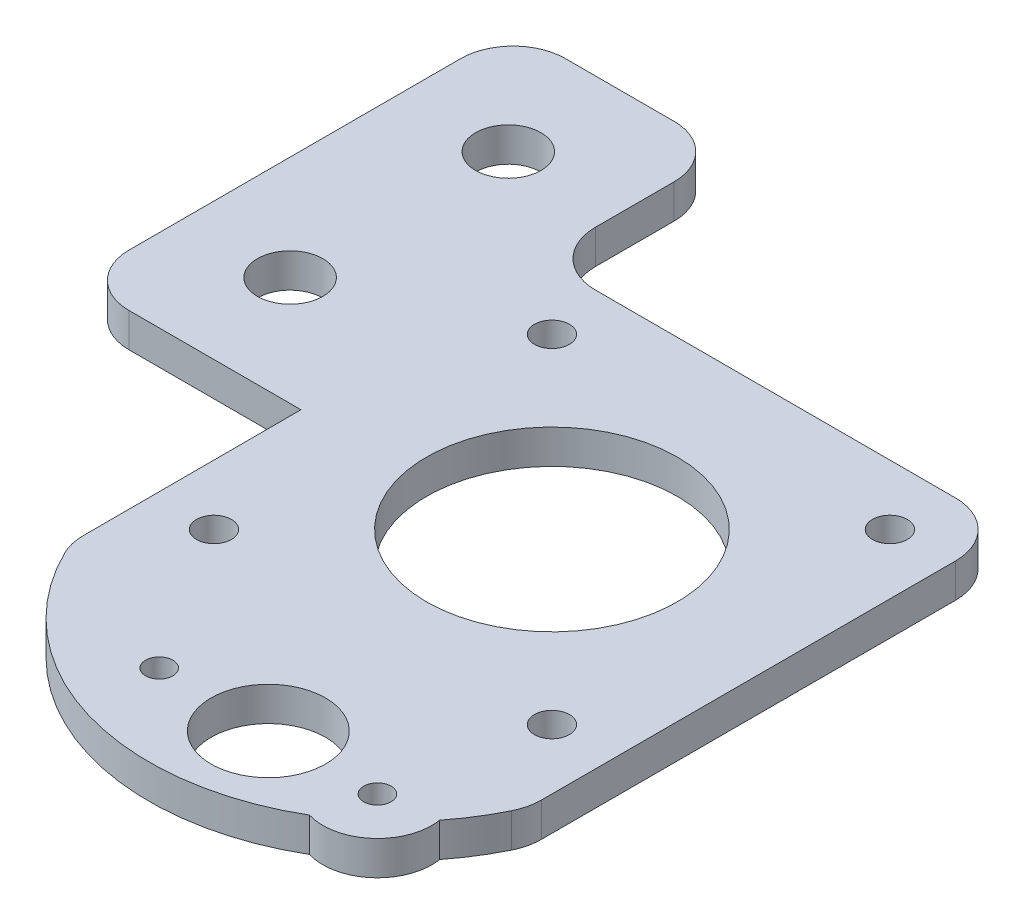
ISO-10303-21;
HEADER;
FILE_DESCRIPTION(('STEP AP214'),'2;1');
FILE_NAME('part.step','',(''),(''),'','','');
FILE_SCHEMA(('AUTOMOTIVE_DESIGN { 1 0 10303 214 1 1 1 1 }'));
ENDSEC;
DATA;
#1=APPLICATION_CONTEXT('core data for automotive mechanical design processes');
#2=APPLICATION_PROTOCOL_DEFINITION('international standard','automotive_design',2000,#1);
#3=PRODUCT_CONTEXT('',#1,'mechanical');
#4=PRODUCT('Part','Part','',(#3));
#5=PRODUCT_RELATED_PRODUCT_CATEGORY('part','',(#4));
#6=PRODUCT_DEFINITION_FORMATION('','',#4);
#7=PRODUCT_DEFINITION_CONTEXT('part definition',#1,'design');
#8=PRODUCT_DEFINITION('design','',#6,#7);
#9=PRODUCT_DEFINITION_SHAPE('','',#8);
#10=(LENGTH_UNIT() NAMED_UNIT(*) SI_UNIT(.MILLI.,.METRE.));
#11=(NAMED_UNIT(*) PLANE_ANGLE_UNIT() SI_UNIT($,.RADIAN.));
#12=(NAMED_UNIT(*) SI_UNIT($,.STERADIAN.) SOLID_ANGLE_UNIT());
#13=UNCERTAINTY_MEASURE_WITH_UNIT(LENGTH_MEASURE(1.E-05),#10,'distance_accuracy_value','');
#14=(GEOMETRIC_REPRESENTATION_CONTEXT(3) GLOBAL_UNCERTAINTY_ASSIGNED_CONTEXT((#13)) GLOBAL_UNIT_ASSIGNED_CONTEXT((#10,
#11,#12)) REPRESENTATION_CONTEXT('',''));
#15=CARTESIAN_POINT('',(0.,0.,0.));
#16=DIRECTION('',(0.,0.,1.));
#17=DIRECTION('',(1.,0.,0.));
#18=AXIS2_PLACEMENT_3D('',#15,#16,#17);
#19=CARTESIAN_POINT('',(22.4102545462496,550.,-34.706758362055));
#20=DIRECTION('',(0.,-1.,0.));
#21=DIRECTION('',(0.,0.,-1.));
#22=AXIS2_PLACEMENT_3D('',#19,#20,#21);
#23=CYLINDRICAL_SURFACE('',#22,4.8);
#24=CARTESIAN_POINT('',(22.4102545462496,546.875,-34.706758362055));
#25=DIRECTION('',(0.,-1.,0.));
#26=DIRECTION('',(0.,0.,-1.));
#27=AXIS2_PLACEMENT_3D('',#24,#25,#26);
#28=CIRCLE('',#27,4.8);
#29=CARTESIAN_POINT('',(17.6102545462496,546.875,-34.706758362055));
#30=VERTEX_POINT('',#29);
#31=CARTESIAN_POINT('',(22.4102545462496,546.875,-39.506758362055));
#32=VERTEX_POINT('',#31);
#33=EDGE_CURVE('E187',#30,#32,#28,.T.);
#34=ORIENTED_EDGE('',*,*,#33,.F.);
#35=DIRECTION('',(0.,-1.,0.));
#36=VECTOR('',#35,1.);
#37=CARTESIAN_POINT('',(17.6102545462496,550.,-34.706758362055));
#38=LINE('',#37,#36);
#39=CARTESIAN_POINT('',(17.6102545462496,550.,-34.706758362055));
#40=VERTEX_POINT('',#39);
#41=EDGE_CURVE('E11',#40,#30,#38,.T.);
#42=ORIENTED_EDGE('',*,*,#41,.F.);
#43=CARTESIAN_POINT('',(22.4102545462496,550.,-34.706758362055));
#44=DIRECTION('',(0.,-1.,0.));
#45=DIRECTION('',(0.,0.,-1.));
#46=AXIS2_PLACEMENT_3D('',#43,#44,#45);
#47=CIRCLE('',#46,4.8);
#48=CARTESIAN_POINT('',(22.4102545462496,550.,-39.506758362055));
#49=VERTEX_POINT('',#48);
#50=EDGE_CURVE('E235',#40,#49,#47,.T.);
#51=ORIENTED_EDGE('',*,*,#50,.T.);
#52=DIRECTION('',(0.,-1.,0.));
#53=VECTOR('',#52,1.);
#54=CARTESIAN_POINT('',(22.4102545462496,550.,-39.506758362055));
#55=LINE('',#54,#53);
#56=EDGE_CURVE('E39',#49,#32,#55,.T.);
#57=ORIENTED_EDGE('',*,*,#56,.T.);
#58=EDGE_LOOP('',(#34,#42,#51,#57));
#59=FACE_BOUND('',#58,.T.);
#60=ADVANCED_FACE('F36',(#59),#23,.T.);
#61=CARTESIAN_POINT('',(17.6102545462496,550.,-4.30675836205496));
#62=DIRECTION('',(-1.,0.,0.));
#63=DIRECTION('',(0.,0.,1.));
#64=AXIS2_PLACEMENT_3D('',#61,#62,#63);
#65=PLANE('',#64);
#66=DIRECTION('',(0.,0.,-1.));
#67=VECTOR('',#66,1.);
#68=CARTESIAN_POINT('',(17.6102545462496,546.875,-4.30675836205496));
#69=LINE('',#68,#67);
#70=CARTESIAN_POINT('',(17.6102545462496,546.875,-4.30675836205496));
#71=VERTEX_POINT('',#70);
#72=EDGE_CURVE('E233',#71,#30,#69,.T.);
#73=ORIENTED_EDGE('',*,*,#72,.F.);
#74=DIRECTION('',(0.,-1.,0.));
#75=VECTOR('',#74,1.);
#76=CARTESIAN_POINT('',(17.6102545462496,550.,-4.30675836205496));
#77=LINE('',#76,#75);
#78=CARTESIAN_POINT('',(17.6102545462496,550.,-4.30675836205496));
#79=VERTEX_POINT('',#78);
#80=EDGE_CURVE('E45',#79,#71,#77,.T.);
#81=ORIENTED_EDGE('',*,*,#80,.F.);
#82=DIRECTION('',(0.,0.,-1.));
#83=VECTOR('',#82,1.);
#84=CARTESIAN_POINT('',(17.6102545462496,550.,-4.30675836205496));
#85=LINE('',#84,#83);
#86=EDGE_CURVE('E177',#79,#40,#85,.T.);
#87=ORIENTED_EDGE('',*,*,#86,.T.);
#88=ORIENTED_EDGE('',*,*,#41,.T.);
#89=EDGE_LOOP('',(#73,#81,#87,#88));
#90=FACE_BOUND('',#89,.T.);
#91=ADVANCED_FACE('F265',(#90),#65,.T.);
#92=CARTESIAN_POINT('',(22.4102545462496,550.,-4.30675836205496));
#93=DIRECTION('',(0.,-1.,0.));
#94=DIRECTION('',(0.,0.,-1.));
#95=AXIS2_PLACEMENT_3D('',#92,#93,#94);
#96=CYLINDRICAL_SURFACE('',#95,4.79999999999998);
#97=CARTESIAN_POINT('',(22.4102545462496,546.875,-4.30675836205496));
#98=DIRECTION('',(0.,-1.,0.));
#99=DIRECTION('',(0.,0.,-1.));
#100=AXIS2_PLACEMENT_3D('',#97,#98,#99);
#101=CIRCLE('',#100,4.79999999999998);
#102=CARTESIAN_POINT('',(22.4102545462496,546.875,0.493241637945018));
#103=VERTEX_POINT('',#102);
#104=EDGE_CURVE('E164',#103,#71,#101,.T.);
#105=ORIENTED_EDGE('',*,*,#104,.F.);
#106=DIRECTION('',(0.,-1.,0.));
#107=VECTOR('',#106,1.);
#108=CARTESIAN_POINT('',(22.4102545462496,550.,0.493241637945018));
#109=LINE('',#108,#107);
#110=CARTESIAN_POINT('',(22.4102545462496,550.,0.493241637945018));
#111=VERTEX_POINT('',#110);
#112=EDGE_CURVE('E159',#111,#103,#109,.T.);
#113=ORIENTED_EDGE('',*,*,#112,.F.);
#114=CARTESIAN_POINT('',(22.4102545462496,550.,-4.30675836205496));
#115=DIRECTION('',(0.,-1.,0.));
#116=DIRECTION('',(0.,0.,-1.));
#117=AXIS2_PLACEMENT_3D('',#114,#115,#116);
#118=CIRCLE('',#117,4.79999999999998);
#119=EDGE_CURVE('E162',#111,#79,#118,.T.);
#120=ORIENTED_EDGE('',*,*,#119,.T.);
#121=ORIENTED_EDGE('',*,*,#80,.T.);
#122=EDGE_LOOP('',(#105,#113,#120,#121));
#123=FACE_BOUND('',#122,.T.);
#124=ADVANCED_FACE('F161',(#123),#96,.T.);
#125=CARTESIAN_POINT('',(38.1662490499618,550.,0.493241637945017));
#126=DIRECTION('',(0.,0.,1.));
#127=DIRECTION('',(1.,0.,0.));
#128=AXIS2_PLACEMENT_3D('',#125,#126,#127);
#129=PLANE('',#128);
#130=DIRECTION('',(-1.,0.,0.));
#131=VECTOR('',#130,1.);
#132=CARTESIAN_POINT('',(38.1662490499618,546.875,0.493241637945017));
#133=LINE('',#132,#131);
#134=CARTESIAN_POINT('',(38.1662490499618,546.875,0.493241637945017));
#135=VERTEX_POINT('',#134);
#136=EDGE_CURVE('E230',#135,#103,#133,.T.);
#137=ORIENTED_EDGE('',*,*,#136,.F.);
#138=DIRECTION('',(0.,-1.,0.));
#139=VECTOR('',#138,1.);
#140=CARTESIAN_POINT('',(38.1662490499618,550.,0.493241637945017));
#141=LINE('',#140,#139);
#142=CARTESIAN_POINT('',(38.1662490499618,550.,0.493241637945017));
#143=VERTEX_POINT('',#142);
#144=EDGE_CURVE('E169',#143,#135,#141,.T.);
#145=ORIENTED_EDGE('',*,*,#144,.F.);
#146=DIRECTION('',(-1.,0.,0.));
#147=VECTOR('',#146,1.);
#148=CARTESIAN_POINT('',(38.1662490499618,550.,0.493241637945017));
#149=LINE('',#148,#147);
#150=EDGE_CURVE('E175',#143,#111,#149,.T.);
#151=ORIENTED_EDGE('',*,*,#150,.T.);
#152=ORIENTED_EDGE('',*,*,#112,.T.);
#153=EDGE_LOOP('',(#137,#145,#151,#152));
#154=FACE_BOUND('',#153,.T.);
#155=ADVANCED_FACE('F179',(#154),#129,.T.);
#156=CARTESIAN_POINT('',(38.182772618466,550.,20.4638413116324));
#157=DIRECTION('',(-0.999999657709173,0.,0.000827394425721258));
#158=DIRECTION('',(0.000827394425721258,0.,0.999999657709174));
#159=AXIS2_PLACEMENT_3D('',#156,#157,#158);
#160=PLANE('',#159);
#161=DIRECTION('',(-0.000827394425721258,0.,-0.999999657709174));
#162=VECTOR('',#161,1.);
#163=CARTESIAN_POINT('',(38.182772618466,546.875,20.4638413116324));
#164=LINE('',#163,#162);
#165=CARTESIAN_POINT('',(38.182772618466,546.875,20.4638413116324));
#166=VERTEX_POINT('',#165);
#167=EDGE_CURVE('E227',#166,#135,#164,.T.);
#168=ORIENTED_EDGE('',*,*,#167,.F.);
#169=DIRECTION('',(0.,-1.,0.));
#170=VECTOR('',#169,1.);
#171=CARTESIAN_POINT('',(38.182772618466,550.,20.4638413116324));
#172=LINE('',#171,#170);
#173=CARTESIAN_POINT('',(38.182772618466,550.,20.4638413116324));
#174=VERTEX_POINT('',#173);
#175=EDGE_CURVE('E239',#174,#166,#172,.T.);
#176=ORIENTED_EDGE('',*,*,#175,.F.);
#177=DIRECTION('',(-0.000827394425721258,0.,-0.999999657709174));
#178=VECTOR('',#177,1.);
#179=CARTESIAN_POINT('',(38.182772618466,550.,20.4638413116324));
#180=LINE('',#179,#178);
#181=EDGE_CURVE('E180',#174,#143,#180,.T.);
#182=ORIENTED_EDGE('',*,*,#181,.T.);
#183=ORIENTED_EDGE('',*,*,#144,.T.);
#184=EDGE_LOOP('',(#168,#176,#182,#183));
#185=FACE_BOUND('',#184,.T.);
#186=ADVANCED_FACE('F278',(#185),#160,.T.);
#187=CARTESIAN_POINT('',(43.1827709070118,550.,20.459704339504));
#188=DIRECTION('',(0.,-1.,0.));
#189=DIRECTION('',(0.,0.,-1.));
#190=AXIS2_PLACEMENT_3D('',#187,#188,#189);
#191=CYLINDRICAL_SURFACE('',#190,4.99999999999986);
#192=CARTESIAN_POINT('',(43.1827709070118,546.875,20.459704339504));
#193=DIRECTION('',(0.,-1.,0.));
#194=DIRECTION('',(0.,0.,-1.));
#195=AXIS2_PLACEMENT_3D('',#192,#193,#194);
#196=CIRCLE('',#195,4.99999999999986);
#197=CARTESIAN_POINT('',(38.6947307033718,546.875,22.66367691885));
#198=VERTEX_POINT('',#197);
#199=EDGE_CURVE('E224',#198,#166,#196,.T.);
#200=ORIENTED_EDGE('',*,*,#199,.F.);
#201=DIRECTION('',(0.,-1.,0.));
#202=VECTOR('',#201,1.);
#203=CARTESIAN_POINT('',(38.6947307033718,550.,22.66367691885));
#204=LINE('',#203,#202);
#205=CARTESIAN_POINT('',(38.6947307033718,550.,22.66367691885));
#206=VERTEX_POINT('',#205);
#207=EDGE_CURVE('E241',#206,#198,#204,.T.);
#208=ORIENTED_EDGE('',*,*,#207,.F.);
#209=CARTESIAN_POINT('',(43.1827709070118,550.,20.459704339504));
#210=DIRECTION('',(0.,-1.,0.));
#211=DIRECTION('',(0.,0.,-1.));
#212=AXIS2_PLACEMENT_3D('',#209,#210,#211);
#213=CIRCLE('',#212,4.99999999999986);
#214=EDGE_CURVE('E182',#206,#174,#213,.T.);
#215=ORIENTED_EDGE('',*,*,#214,.T.);
#216=ORIENTED_EDGE('',*,*,#175,.T.);
#217=EDGE_LOOP('',(#200,#208,#215,#216));
#218=FACE_BOUND('',#217,.T.);
#219=ADVANCED_FACE('F281',(#218),#191,.T.);
#220=CARTESIAN_POINT('',(59.1784621626913,550.,12.604590901213));
#221=DIRECTION('',(0.,-1.,0.));
#222=DIRECTION('',(0.,0.,-1.));
#223=AXIS2_PLACEMENT_3D('',#220,#221,#222);
#224=CYLINDRICAL_SURFACE('',#223,22.8203520132302);
#225=CARTESIAN_POINT('',(59.1784621626913,546.875,12.604590901213));
#226=DIRECTION('',(0.,-1.,0.));
#227=DIRECTION('',(0.,0.,-1.));
#228=AXIS2_PLACEMENT_3D('',#225,#226,#227);
#229=CIRCLE('',#228,22.8203520132302);
#230=CARTESIAN_POINT('',(70.7355063181381,546.875,32.2820703230493));
#231=VERTEX_POINT('',#230);
#232=EDGE_CURVE('E221',#231,#198,#229,.T.);
#233=ORIENTED_EDGE('',*,*,#232,.F.);
#234=DIRECTION('',(0.,-1.,0.));
#235=VECTOR('',#234,1.);
#236=CARTESIAN_POINT('',(70.7355063181381,550.,32.2820703230493));
#237=LINE('',#236,#235);
#238=CARTESIAN_POINT('',(70.7355063181381,550.,32.2820703230493));
#239=VERTEX_POINT('',#238);
#240=EDGE_CURVE('E243',#239,#231,#237,.T.);
#241=ORIENTED_EDGE('',*,*,#240,.F.);
#242=CARTESIAN_POINT('',(59.1784621626913,550.,12.604590901213));
#243=DIRECTION('',(0.,-1.,0.));
#244=DIRECTION('',(0.,0.,-1.));
#245=AXIS2_PLACEMENT_3D('',#242,#243,#244);
#246=CIRCLE('',#245,22.8203520132302);
#247=EDGE_CURVE('E470',#239,#206,#246,.T.);
#248=ORIENTED_EDGE('',*,*,#247,.T.);
#249=ORIENTED_EDGE('',*,*,#207,.T.);
#250=EDGE_LOOP('',(#233,#241,#248,#249));
#251=FACE_BOUND('',#250,.T.);
#252=ADVANCED_FACE('F285',(#251),#224,.T.);
#253=CARTESIAN_POINT('',(72.1732545462503,550.,27.4932416528461));
#254=DIRECTION('',(0.,-1.,0.));
#255=DIRECTION('',(0.,0.,-1.));
#256=AXIS2_PLACEMENT_3D('',#253,#254,#255);
#257=CYLINDRICAL_SURFACE('',#256,4.99999999999999);
#258=CARTESIAN_POINT('',(72.1732545462503,546.875,27.4932416528461));
#259=DIRECTION('',(0.,-1.,0.));
#260=DIRECTION('',(0.,0.,-1.));
#261=AXIS2_PLACEMENT_3D('',#258,#259,#260);
#262=CIRCLE('',#261,4.99999999999999);
#263=CARTESIAN_POINT('',(77.1125108810002,546.875,26.7162301602457));
#264=VERTEX_POINT('',#263);
#265=EDGE_CURVE('E218',#264,#231,#262,.T.);
#266=ORIENTED_EDGE('',*,*,#265,.F.);
#267=DIRECTION('',(0.,-1.,0.));
#268=VECTOR('',#267,1.);
#269=CARTESIAN_POINT('',(77.1125108810002,550.,26.7162301602457));
#270=LINE('',#269,#268);
#271=CARTESIAN_POINT('',(77.1125108810002,550.,26.7162301602457));
#272=VERTEX_POINT('',#271);
#273=EDGE_CURVE('E245',#272,#264,#270,.T.);
#274=ORIENTED_EDGE('',*,*,#273,.F.);
#275=CARTESIAN_POINT('',(72.1732545462503,550.,27.4932416528461));
#276=DIRECTION('',(0.,-1.,0.));
#277=DIRECTION('',(0.,0.,-1.));
#278=AXIS2_PLACEMENT_3D('',#275,#276,#277);
#279=CIRCLE('',#278,4.99999999999999);
#280=EDGE_CURVE('E467',#272,#239,#279,.T.);
#281=ORIENTED_EDGE('',*,*,#280,.T.);
#282=ORIENTED_EDGE('',*,*,#240,.T.);
#283=EDGE_LOOP('',(#266,#274,#281,#282));
#284=FACE_BOUND('',#283,.T.);
#285=ADVANCED_FACE('F289',(#284),#257,.T.);
#286=CARTESIAN_POINT('',(59.1784621626913,550.,12.604590901213));
#287=DIRECTION('',(0.,-1.,0.));
#288=DIRECTION('',(0.,0.,-1.));
#289=AXIS2_PLACEMENT_3D('',#286,#287,#288);
#290=CYLINDRICAL_SURFACE('',#289,22.8203520132304);
#291=CARTESIAN_POINT('',(59.1784621626913,546.875,12.604590901213));
#292=DIRECTION('',(0.,-1.,0.));
#293=DIRECTION('',(0.,0.,-1.));
#294=AXIS2_PLACEMENT_3D('',#291,#292,#293);
#295=CIRCLE('',#294,22.8203520132304);
#296=CARTESIAN_POINT('',(79.6610425460844,546.875,22.666020563323));
#297=VERTEX_POINT('',#296);
#298=EDGE_CURVE('E215',#297,#264,#295,.T.);
#299=ORIENTED_EDGE('',*,*,#298,.F.);
#300=DIRECTION('',(0.,-1.,0.));
#301=VECTOR('',#300,1.);
#302=CARTESIAN_POINT('',(79.6610425460844,550.,22.666020563323));
#303=LINE('',#302,#301);
#304=CARTESIAN_POINT('',(79.6610425460844,550.,22.666020563323));
#305=VERTEX_POINT('',#304);
#306=EDGE_CURVE('E247',#305,#297,#303,.T.);
#307=ORIENTED_EDGE('',*,*,#306,.F.);
#308=CARTESIAN_POINT('',(59.1784621626913,550.,12.604590901213));
#309=DIRECTION('',(0.,-1.,0.));
#310=DIRECTION('',(0.,0.,-1.));
#311=AXIS2_PLACEMENT_3D('',#308,#309,#310);
#312=CIRCLE('',#311,22.8203520132304);
#313=EDGE_CURVE('E464',#305,#272,#312,.T.);
#314=ORIENTED_EDGE('',*,*,#313,.T.);
#315=ORIENTED_EDGE('',*,*,#273,.T.);
#316=EDGE_LOOP('',(#299,#307,#314,#315));
#317=FACE_BOUND('',#316,.T.);
#318=ADVANCED_FACE('F293',(#317),#290,.T.);
#319=CARTESIAN_POINT('',(75.1732545462503,550.,20.4615344852211));
#320=DIRECTION('',(0.,-1.,0.));
#321=DIRECTION('',(0.,0.,-1.));
#322=AXIS2_PLACEMENT_3D('',#319,#320,#321);
#323=CYLINDRICAL_SURFACE('',#322,5.00000000000001);
#324=CARTESIAN_POINT('',(75.1732545462503,546.875,20.4615344852211));
#325=DIRECTION('',(0.,-1.,0.));
#326=DIRECTION('',(0.,0.,-1.));
#327=AXIS2_PLACEMENT_3D('',#324,#325,#326);
#328=CIRCLE('',#327,5.00000000000001);
#329=CARTESIAN_POINT('',(80.1732545462503,546.875,20.4615344852211));
#330=VERTEX_POINT('',#329);
#331=EDGE_CURVE('E212',#330,#297,#328,.T.);
#332=ORIENTED_EDGE('',*,*,#331,.F.);
#333=DIRECTION('',(0.,-1.,0.));
#334=VECTOR('',#333,1.);
#335=CARTESIAN_POINT('',(80.1732545462503,550.,20.4615344852211));
#336=LINE('',#335,#334);
#337=CARTESIAN_POINT('',(80.1732545462503,550.,20.4615344852211));
#338=VERTEX_POINT('',#337);
#339=EDGE_CURVE('E249',#338,#330,#336,.T.);
#340=ORIENTED_EDGE('',*,*,#339,.F.);
#341=CARTESIAN_POINT('',(75.1732545462503,550.,20.4615344852211));
#342=DIRECTION('',(0.,-1.,0.));
#343=DIRECTION('',(0.,0.,-1.));
#344=AXIS2_PLACEMENT_3D('',#341,#342,#343);
#345=CIRCLE('',#344,5.00000000000001);
#346=EDGE_CURVE('E461',#338,#305,#345,.T.);
#347=ORIENTED_EDGE('',*,*,#346,.T.);
#348=ORIENTED_EDGE('',*,*,#306,.T.);
#349=EDGE_LOOP('',(#332,#340,#347,#348));
#350=FACE_BOUND('',#349,.T.);
#351=ADVANCED_FACE('F297',(#350),#323,.T.);
#352=CARTESIAN_POINT('',(80.1732545462503,550.,-17.506758362055));
#353=DIRECTION('',(1.,0.,0.));
#354=DIRECTION('',(0.,0.,-1.));
#355=AXIS2_PLACEMENT_3D('',#352,#353,#354);
#356=PLANE('',#355);
#357=DIRECTION('',(0.,0.,1.));
#358=VECTOR('',#357,1.);
#359=CARTESIAN_POINT('',(80.1732545462503,546.875,-17.506758362055));
#360=LINE('',#359,#358);
#361=CARTESIAN_POINT('',(80.1732545462503,546.875,-17.506758362055));
#362=VERTEX_POINT('',#361);
#363=EDGE_CURVE('E209',#362,#330,#360,.T.);
#364=ORIENTED_EDGE('',*,*,#363,.F.);
#365=DIRECTION('',(0.,-1.,0.));
#366=VECTOR('',#365,1.);
#367=CARTESIAN_POINT('',(80.1732545462503,550.,-17.506758362055));
#368=LINE('',#367,#366);
#369=CARTESIAN_POINT('',(80.1732545462503,550.,-17.506758362055));
#370=VERTEX_POINT('',#369);
#371=EDGE_CURVE('E251',#370,#362,#368,.T.);
#372=ORIENTED_EDGE('',*,*,#371,.F.);
#373=DIRECTION('',(0.,0.,1.));
#374=VECTOR('',#373,1.);
#375=CARTESIAN_POINT('',(80.1732545462503,550.,-17.506758362055));
#376=LINE('',#375,#374);
#377=EDGE_CURVE('E458',#370,#338,#376,.T.);
#378=ORIENTED_EDGE('',*,*,#377,.T.);
#379=ORIENTED_EDGE('',*,*,#339,.T.);
#380=EDGE_LOOP('',(#364,#372,#378,#379));
#381=FACE_BOUND('',#380,.T.);
#382=ADVANCED_FACE('F301',(#381),#356,.T.);
#383=CARTESIAN_POINT('',(75.1732545462503,550.,-17.506758362055));
#384=DIRECTION('',(0.,-1.,0.));
#385=DIRECTION('',(0.,0.,-1.));
#386=AXIS2_PLACEMENT_3D('',#383,#384,#385);
#387=CYLINDRICAL_SURFACE('',#386,5.);
#388=CARTESIAN_POINT('',(75.1732545462503,546.875,-17.506758362055));
#389=DIRECTION('',(0.,-1.,0.));
#390=DIRECTION('',(0.,0.,-1.));
#391=AXIS2_PLACEMENT_3D('',#388,#389,#390);
#392=CIRCLE('',#391,5.);
#393=CARTESIAN_POINT('',(75.1732545462503,546.875,-22.506758362055));
#394=VERTEX_POINT('',#393);
#395=EDGE_CURVE('E206',#394,#362,#392,.T.);
#396=ORIENTED_EDGE('',*,*,#395,.F.);
#397=DIRECTION('',(0.,-1.,0.));
#398=VECTOR('',#397,1.);
#399=CARTESIAN_POINT('',(75.1732545462503,550.,-22.506758362055));
#400=LINE('',#399,#398);
#401=CARTESIAN_POINT('',(75.1732545462503,550.,-22.506758362055));
#402=VERTEX_POINT('',#401);
#403=EDGE_CURVE('E253',#402,#394,#400,.T.);
#404=ORIENTED_EDGE('',*,*,#403,.F.);
#405=CARTESIAN_POINT('',(75.1732545462503,550.,-17.506758362055));
#406=DIRECTION('',(0.,-1.,0.));
#407=DIRECTION('',(0.,0.,-1.));
#408=AXIS2_PLACEMENT_3D('',#405,#406,#407);
#409=CIRCLE('',#408,5.);
#410=EDGE_CURVE('E455',#402,#370,#409,.T.);
#411=ORIENTED_EDGE('',*,*,#410,.T.);
#412=ORIENTED_EDGE('',*,*,#371,.T.);
#413=EDGE_LOOP('',(#396,#404,#411,#412));
#414=FACE_BOUND('',#413,.T.);
#415=ADVANCED_FACE('F305',(#414),#387,.T.);
#416=CARTESIAN_POINT('',(42.1732545462513,550.,-22.506758362055));
#417=DIRECTION('',(0.,0.,-1.));
#418=DIRECTION('',(-1.,0.,0.));
#419=AXIS2_PLACEMENT_3D('',#416,#417,#418);
#420=PLANE('',#419);
#421=DIRECTION('',(1.,0.,0.));
#422=VECTOR('',#421,1.);
#423=CARTESIAN_POINT('',(42.1732545462513,546.875,-22.506758362055));
#424=LINE('',#423,#422);
#425=CARTESIAN_POINT('',(42.1732545462513,546.875,-22.506758362055));
#426=VERTEX_POINT('',#425);
#427=EDGE_CURVE('E203',#426,#394,#424,.T.);
#428=ORIENTED_EDGE('',*,*,#427,.F.);
#429=DIRECTION('',(0.,-1.,0.));
#430=VECTOR('',#429,1.);
#431=CARTESIAN_POINT('',(42.1732545462513,550.,-22.506758362055));
#432=LINE('',#431,#430);
#433=CARTESIAN_POINT('',(42.1732545462513,550.,-22.506758362055));
#434=VERTEX_POINT('',#433);
#435=EDGE_CURVE('E255',#434,#426,#432,.T.);
#436=ORIENTED_EDGE('',*,*,#435,.F.);
#437=DIRECTION('',(1.,0.,0.));
#438=VECTOR('',#437,1.);
#439=CARTESIAN_POINT('',(42.1732545462513,550.,-22.506758362055));
#440=LINE('',#439,#438);
#441=EDGE_CURVE('E452',#434,#402,#440,.T.);
#442=ORIENTED_EDGE('',*,*,#441,.T.);
#443=ORIENTED_EDGE('',*,*,#403,.T.);
#444=EDGE_LOOP('',(#428,#436,#442,#443));
#445=FACE_BOUND('',#444,.T.);
#446=ADVANCED_FACE('F309',(#445),#420,.T.);
#447=CARTESIAN_POINT('',(42.1732545462513,550.,-27.506758362055));
#448=DIRECTION('',(0.,-1.,0.));
#449=DIRECTION('',(0.,0.,-1.));
#450=AXIS2_PLACEMENT_3D('',#447,#448,#449);
#451=CYLINDRICAL_SURFACE('',#450,5.);
#452=CARTESIAN_POINT('',(42.1732545462513,546.875,-27.506758362055));
#453=DIRECTION('',(0.,1.,0.));
#454=DIRECTION('',(0.,0.,1.));
#455=AXIS2_PLACEMENT_3D('',#452,#453,#454);
#456=CIRCLE('',#455,5.);
#457=CARTESIAN_POINT('',(37.1732545462513,546.875,-27.506758362055));
#458=VERTEX_POINT('',#457);
#459=EDGE_CURVE('E200',#458,#426,#456,.T.);
#460=ORIENTED_EDGE('',*,*,#459,.F.);
#461=DIRECTION('',(0.,-1.,0.));
#462=VECTOR('',#461,1.);
#463=CARTESIAN_POINT('',(37.1732545462513,550.,-27.506758362055));
#464=LINE('',#463,#462);
#465=CARTESIAN_POINT('',(37.1732545462513,550.,-27.506758362055));
#466=VERTEX_POINT('',#465);
#467=EDGE_CURVE('E257',#466,#458,#464,.T.);
#468=ORIENTED_EDGE('',*,*,#467,.F.);
#469=CARTESIAN_POINT('',(42.1732545462513,550.,-27.506758362055));
#470=DIRECTION('',(0.,1.,0.));
#471=DIRECTION('',(0.,0.,1.));
#472=AXIS2_PLACEMENT_3D('',#469,#470,#471);
#473=CIRCLE('',#472,5.);
#474=EDGE_CURVE('E449',#466,#434,#473,.T.);
#475=ORIENTED_EDGE('',*,*,#474,.T.);
#476=ORIENTED_EDGE('',*,*,#435,.T.);
#477=EDGE_LOOP('',(#460,#468,#475,#476));
#478=FACE_BOUND('',#477,.T.);
#479=ADVANCED_FACE('F313',(#478),#451,.F.);
#480=CARTESIAN_POINT('',(37.1732545462513,550.,-34.706758362055));
#481=DIRECTION('',(1.,0.,0.));
#482=DIRECTION('',(0.,0.,-1.));
#483=AXIS2_PLACEMENT_3D('',#480,#481,#482);
#484=PLANE('',#483);
#485=DIRECTION('',(0.,0.,1.));
#486=VECTOR('',#485,1.);
#487=CARTESIAN_POINT('',(37.1732545462513,546.875,-34.706758362055));
#488=LINE('',#487,#486);
#489=CARTESIAN_POINT('',(37.1732545462513,546.875,-34.706758362055));
#490=VERTEX_POINT('',#489);
#491=EDGE_CURVE('E197',#490,#458,#488,.T.);
#492=ORIENTED_EDGE('',*,*,#491,.F.);
#493=DIRECTION('',(0.,-1.,0.));
#494=VECTOR('',#493,1.);
#495=CARTESIAN_POINT('',(37.1732545462513,550.,-34.706758362055));
#496=LINE('',#495,#494);
#497=CARTESIAN_POINT('',(37.1732545462513,550.,-34.706758362055));
#498=VERTEX_POINT('',#497);
#499=EDGE_CURVE('E259',#498,#490,#496,.T.);
#500=ORIENTED_EDGE('',*,*,#499,.F.);
#501=DIRECTION('',(0.,0.,1.));
#502=VECTOR('',#501,1.);
#503=CARTESIAN_POINT('',(37.1732545462513,550.,-34.706758362055));
#504=LINE('',#503,#502);
#505=EDGE_CURVE('E446',#498,#466,#504,.T.);
#506=ORIENTED_EDGE('',*,*,#505,.T.);
#507=ORIENTED_EDGE('',*,*,#467,.T.);
#508=EDGE_LOOP('',(#492,#500,#506,#507));
#509=FACE_BOUND('',#508,.T.);
#510=ADVANCED_FACE('F317',(#509),#484,.T.);
#511=CARTESIAN_POINT('',(32.3732545462513,550.,-34.706758362055));
#512=DIRECTION('',(0.,-1.,0.));
#513=DIRECTION('',(0.,0.,-1.));
#514=AXIS2_PLACEMENT_3D('',#511,#512,#513);
#515=CYLINDRICAL_SURFACE('',#514,4.8);
#516=CARTESIAN_POINT('',(32.3732545462513,546.875,-34.706758362055));
#517=DIRECTION('',(0.,-1.,0.));
#518=DIRECTION('',(0.,0.,-1.));
#519=AXIS2_PLACEMENT_3D('',#516,#517,#518);
#520=CIRCLE('',#519,4.8);
#521=CARTESIAN_POINT('',(32.3732545462513,546.875,-39.506758362055));
#522=VERTEX_POINT('',#521);
#523=EDGE_CURVE('E194',#522,#490,#520,.T.);
#524=ORIENTED_EDGE('',*,*,#523,.F.);
#525=DIRECTION('',(0.,-1.,0.));
#526=VECTOR('',#525,1.);
#527=CARTESIAN_POINT('',(32.3732545462513,550.,-39.506758362055));
#528=LINE('',#527,#526);
#529=CARTESIAN_POINT('',(32.3732545462513,550.,-39.506758362055));
#530=VERTEX_POINT('',#529);
#531=EDGE_CURVE('E260',#530,#522,#528,.T.);
#532=ORIENTED_EDGE('',*,*,#531,.F.);
#533=CARTESIAN_POINT('',(32.3732545462513,550.,-34.706758362055));
#534=DIRECTION('',(0.,-1.,0.));
#535=DIRECTION('',(0.,0.,-1.));
#536=AXIS2_PLACEMENT_3D('',#533,#534,#535);
#537=CIRCLE('',#536,4.8);
#538=EDGE_CURVE('E443',#530,#498,#537,.T.);
#539=ORIENTED_EDGE('',*,*,#538,.T.);
#540=ORIENTED_EDGE('',*,*,#499,.T.);
#541=EDGE_LOOP('',(#524,#532,#539,#540));
#542=FACE_BOUND('',#541,.T.);
#543=ADVANCED_FACE('F321',(#542),#515,.T.);
#544=CARTESIAN_POINT('',(22.4102545462496,550.,-39.506758362055));
#545=DIRECTION('',(0.,0.,-1.));
#546=DIRECTION('',(-1.,0.,0.));
#547=AXIS2_PLACEMENT_3D('',#544,#545,#546);
#548=PLANE('',#547);
#549=DIRECTION('',(1.,0.,0.));
#550=VECTOR('',#549,1.);
#551=CARTESIAN_POINT('',(22.4102545462496,546.875,-39.506758362055));
#552=LINE('',#551,#550);
#553=EDGE_CURVE('E190',#32,#522,#552,.T.);
#554=ORIENTED_EDGE('',*,*,#553,.F.);
#555=ORIENTED_EDGE('',*,*,#56,.F.);
#556=DIRECTION('',(1.,0.,0.));
#557=VECTOR('',#556,1.);
#558=CARTESIAN_POINT('',(22.4102545462496,550.,-39.506758362055));
#559=LINE('',#558,#557);
#560=EDGE_CURVE('E441',#49,#530,#559,.T.);
#561=ORIENTED_EDGE('',*,*,#560,.T.);
#562=ORIENTED_EDGE('',*,*,#531,.T.);
#563=EDGE_LOOP('',(#554,#555,#561,#562));
#564=FACE_BOUND('',#563,.T.);
#565=ADVANCED_FACE('F262',(#564),#548,.T.);
#566=CARTESIAN_POINT('',(22.4102545462496,550.,-34.706758362055));
#567=DIRECTION('',(0.,-1.,0.));
#568=DIRECTION('',(0.,0.,-1.));
#569=AXIS2_PLACEMENT_3D('',#566,#567,#568);
#570=PLANE('',#569);
#571=CARTESIAN_POINT('',(72.1732545462503,550.,27.4932416528461));
#572=DIRECTION('',(0.,-1.,0.));
#573=DIRECTION('',(0.,0.,-1.));
#574=AXIS2_PLACEMENT_3D('',#571,#572,#573);
#575=CIRCLE('',#574,1.24999999999999);
#576=CARTESIAN_POINT('',(72.1732545462503,550.,26.2432416528461));
#577=VERTEX_POINT('',#576);
#578=EDGE_CURVE('E380',#577,#577,#575,.T.);
#579=ORIENTED_EDGE('',*,*,#578,.T.);
#580=EDGE_LOOP('',(#579));
#581=FACE_BOUND('',#580,.T.);
#582=CARTESIAN_POINT('',(52.1732545462503,550.,27.4932416528461));
#583=DIRECTION('',(0.,-1.,0.));
#584=DIRECTION('',(0.,0.,-1.));
#585=AXIS2_PLACEMENT_3D('',#582,#583,#584);
#586=CIRCLE('',#585,1.24999999999999);
#587=CARTESIAN_POINT('',(52.1732545462503,550.,26.2432416528461));
#588=VERTEX_POINT('',#587);
#589=EDGE_CURVE('E390',#588,#588,#586,.T.);
#590=ORIENTED_EDGE('',*,*,#589,.T.);
#591=EDGE_LOOP('',(#590));
#592=FACE_BOUND('',#591,.T.);
#593=CARTESIAN_POINT('',(27.1732545462503,550.,-9.50675836205498));
#594=DIRECTION('',(0.,-1.,0.));
#595=DIRECTION('',(0.,0.,-1.));
#596=AXIS2_PLACEMENT_3D('',#593,#594,#595);
#597=CIRCLE('',#596,2.99999999999999);
#598=CARTESIAN_POINT('',(27.1732545462503,550.,-12.506758362055));
#599=VERTEX_POINT('',#598);
#600=EDGE_CURVE('E396',#599,#599,#597,.T.);
#601=ORIENTED_EDGE('',*,*,#600,.T.);
#602=EDGE_LOOP('',(#601));
#603=FACE_BOUND('',#602,.T.);
#604=CARTESIAN_POINT('',(27.1732545462503,550.,-29.506758362055));
#605=DIRECTION('',(0.,-1.,0.));
#606=DIRECTION('',(0.,0.,-1.));
#607=AXIS2_PLACEMENT_3D('',#604,#605,#606);
#608=CIRCLE('',#607,2.99999999999999);
#609=CARTESIAN_POINT('',(27.1732545462503,550.,-32.506758362055));
#610=VERTEX_POINT('',#609);
#611=EDGE_CURVE('E402',#610,#610,#608,.T.);
#612=ORIENTED_EDGE('',*,*,#611,.T.);
#613=EDGE_LOOP('',(#612));
#614=FACE_BOUND('',#613,.T.);
#615=CARTESIAN_POINT('',(59.1732545462503,550.,-1.50675836205497));
#616=DIRECTION('',(0.,-1.,0.));
#617=DIRECTION('',(0.,0.,-1.));
#618=AXIS2_PLACEMENT_3D('',#615,#616,#617);
#619=CIRCLE('',#618,11.5);
#620=CARTESIAN_POINT('',(59.1732545462503,550.,-13.006758362055));
#621=VERTEX_POINT('',#620);
#622=EDGE_CURVE('E408',#621,#621,#619,.T.);
#623=ORIENTED_EDGE('',*,*,#622,.T.);
#624=EDGE_LOOP('',(#623));
#625=FACE_BOUND('',#624,.T.);
#626=CARTESIAN_POINT('',(74.6641963550946,550.,13.9841834467893));
#627=DIRECTION('',(0.,-1.,0.));
#628=DIRECTION('',(0.,0.,-1.));
#629=AXIS2_PLACEMENT_3D('',#626,#627,#628);
#630=CIRCLE('',#629,1.59999999999999);
#631=CARTESIAN_POINT('',(74.6641963550946,550.,12.3841834467893));
#632=VERTEX_POINT('',#631);
#633=EDGE_CURVE('E414',#632,#632,#630,.T.);
#634=ORIENTED_EDGE('',*,*,#633,.T.);
#635=EDGE_LOOP('',(#634));
#636=FACE_BOUND('',#635,.T.);
#637=CARTESIAN_POINT('',(43.682312737406,550.,13.9841834467893));
#638=DIRECTION('',(0.,-1.,0.));
#639=DIRECTION('',(0.,0.,-1.));
#640=AXIS2_PLACEMENT_3D('',#637,#638,#639);
#641=CIRCLE('',#640,1.59999999999999);
#642=CARTESIAN_POINT('',(43.682312737406,550.,12.3841834467893));
#643=VERTEX_POINT('',#642);
#644=EDGE_CURVE('E420',#643,#643,#641,.T.);
#645=ORIENTED_EDGE('',*,*,#644,.T.);
#646=EDGE_LOOP('',(#645));
#647=FACE_BOUND('',#646,.T.);
#648=CARTESIAN_POINT('',(43.682312737406,550.,-16.9977001708993));
#649=DIRECTION('',(0.,-1.,0.));
#650=DIRECTION('',(0.,0.,-1.));
#651=AXIS2_PLACEMENT_3D('',#648,#649,#650);
#652=CIRCLE('',#651,1.59999999999999);
#653=CARTESIAN_POINT('',(43.682312737406,550.,-18.5977001708993));
#654=VERTEX_POINT('',#653);
#655=EDGE_CURVE('E426',#654,#654,#652,.T.);
#656=ORIENTED_EDGE('',*,*,#655,.T.);
#657=EDGE_LOOP('',(#656));
#658=FACE_BOUND('',#657,.T.);
#659=CARTESIAN_POINT('',(74.6641963550946,550.,-16.9977001708993));
#660=DIRECTION('',(0.,-1.,0.));
#661=DIRECTION('',(0.,0.,-1.));
#662=AXIS2_PLACEMENT_3D('',#659,#660,#661);
#663=CIRCLE('',#662,1.59999999999999);
#664=CARTESIAN_POINT('',(74.6641963550946,550.,-18.5977001708993));
#665=VERTEX_POINT('',#664);
#666=EDGE_CURVE('E432',#665,#665,#663,.T.);
#667=ORIENTED_EDGE('',*,*,#666,.T.);
#668=EDGE_LOOP('',(#667));
#669=FACE_BOUND('',#668,.T.);
#670=CARTESIAN_POINT('',(62.1732545462503,550.,27.493241637945));
#671=DIRECTION('',(0.,-1.,0.));
#672=DIRECTION('',(0.,0.,-1.));
#673=AXIS2_PLACEMENT_3D('',#670,#671,#672);
#674=CIRCLE('',#673,5.25000000000001);
#675=CARTESIAN_POINT('',(62.1732545462503,550.,22.243241637945));
#676=VERTEX_POINT('',#675);
#677=EDGE_CURVE('E191',#676,#676,#674,.T.);
#678=ORIENTED_EDGE('',*,*,#677,.T.);
#679=EDGE_LOOP('',(#678));
#680=FACE_BOUND('',#679,.T.);
#681=ORIENTED_EDGE('',*,*,#50,.F.);
#682=ORIENTED_EDGE('',*,*,#86,.F.);
#683=ORIENTED_EDGE('',*,*,#119,.F.);
#684=ORIENTED_EDGE('',*,*,#150,.F.);
#685=ORIENTED_EDGE('',*,*,#181,.F.);
#686=ORIENTED_EDGE('',*,*,#214,.F.);
#687=ORIENTED_EDGE('',*,*,#247,.F.);
#688=ORIENTED_EDGE('',*,*,#280,.F.);
#689=ORIENTED_EDGE('',*,*,#313,.F.);
#690=ORIENTED_EDGE('',*,*,#346,.F.);
#691=ORIENTED_EDGE('',*,*,#377,.F.);
#692=ORIENTED_EDGE('',*,*,#410,.F.);
#693=ORIENTED_EDGE('',*,*,#441,.F.);
#694=ORIENTED_EDGE('',*,*,#474,.F.);
#695=ORIENTED_EDGE('',*,*,#505,.F.);
#696=ORIENTED_EDGE('',*,*,#538,.F.);
#697=ORIENTED_EDGE('',*,*,#560,.F.);
#698=EDGE_LOOP('',(#681,#682,#683,#684,#685,#686,#687,#688,#689,#690,#691,#692,#693,#694,#695,
#696,#697));
#699=FACE_BOUND('',#698,.T.);
#700=ADVANCED_FACE('F173',(#581,#592,#603,#614,#625,#636,#647,#658,#669,#680,#699),#570,.F.);
#701=CARTESIAN_POINT('',(22.4102545462496,546.875,-34.706758362055));
#702=DIRECTION('',(0.,-1.,0.));
#703=DIRECTION('',(0.,0.,-1.));
#704=AXIS2_PLACEMENT_3D('',#701,#702,#703);
#705=PLANE('',#704);
#706=CARTESIAN_POINT('',(72.1732545462503,546.875,27.4932416528461));
#707=DIRECTION('',(0.,-1.,0.));
#708=DIRECTION('',(0.,0.,-1.));
#709=AXIS2_PLACEMENT_3D('',#706,#707,#708);
#710=CIRCLE('',#709,1.24999999999999);
#711=CARTESIAN_POINT('',(72.1732545462503,546.875,26.2432416528461));
#712=VERTEX_POINT('',#711);
#713=EDGE_CURVE('E383',#712,#712,#710,.T.);
#714=ORIENTED_EDGE('',*,*,#713,.F.);
#715=EDGE_LOOP('',(#714));
#716=FACE_BOUND('',#715,.T.);
#717=CARTESIAN_POINT('',(52.1732545462503,546.875,27.4932416528461));
#718=DIRECTION('',(0.,-1.,0.));
#719=DIRECTION('',(0.,0.,-1.));
#720=AXIS2_PLACEMENT_3D('',#717,#718,#719);
#721=CIRCLE('',#720,1.24999999999999);
#722=CARTESIAN_POINT('',(52.1732545462503,546.875,26.2432416528461));
#723=VERTEX_POINT('',#722);
#724=EDGE_CURVE('E385',#723,#723,#721,.T.);
#725=ORIENTED_EDGE('',*,*,#724,.F.);
#726=EDGE_LOOP('',(#725));
#727=FACE_BOUND('',#726,.T.);
#728=CARTESIAN_POINT('',(27.1732545462503,546.875,-9.50675836205498));
#729=DIRECTION('',(0.,-1.,0.));
#730=DIRECTION('',(0.,0.,-1.));
#731=AXIS2_PLACEMENT_3D('',#728,#729,#730);
#732=CIRCLE('',#731,2.99999999999999);
#733=CARTESIAN_POINT('',(27.1732545462503,546.875,-12.506758362055));
#734=VERTEX_POINT('',#733);
#735=EDGE_CURVE('E393',#734,#734,#732,.T.);
#736=ORIENTED_EDGE('',*,*,#735,.F.);
#737=EDGE_LOOP('',(#736));
#738=FACE_BOUND('',#737,.T.);
#739=CARTESIAN_POINT('',(27.1732545462503,546.875,-29.506758362055));
#740=DIRECTION('',(0.,-1.,0.));
#741=DIRECTION('',(0.,0.,-1.));
#742=AXIS2_PLACEMENT_3D('',#739,#740,#741);
#743=CIRCLE('',#742,2.99999999999999);
#744=CARTESIAN_POINT('',(27.1732545462503,546.875,-32.506758362055));
#745=VERTEX_POINT('',#744);
#746=EDGE_CURVE('E399',#745,#745,#743,.T.);
#747=ORIENTED_EDGE('',*,*,#746,.F.);
#748=EDGE_LOOP('',(#747));
#749=FACE_BOUND('',#748,.T.);
#750=CARTESIAN_POINT('',(59.1732545462503,546.875,-1.50675836205497));
#751=DIRECTION('',(0.,-1.,0.));
#752=DIRECTION('',(0.,0.,-1.));
#753=AXIS2_PLACEMENT_3D('',#750,#751,#752);
#754=CIRCLE('',#753,11.5);
#755=CARTESIAN_POINT('',(59.1732545462503,546.875,-13.006758362055));
#756=VERTEX_POINT('',#755);
#757=EDGE_CURVE('E405',#756,#756,#754,.T.);
#758=ORIENTED_EDGE('',*,*,#757,.F.);
#759=EDGE_LOOP('',(#758));
#760=FACE_BOUND('',#759,.T.);
#761=CARTESIAN_POINT('',(74.6641963550946,546.875,13.9841834467893));
#762=DIRECTION('',(0.,-1.,0.));
#763=DIRECTION('',(0.,0.,-1.));
#764=AXIS2_PLACEMENT_3D('',#761,#762,#763);
#765=CIRCLE('',#764,1.59999999999999);
#766=CARTESIAN_POINT('',(74.6641963550946,546.875,12.3841834467893));
#767=VERTEX_POINT('',#766);
#768=EDGE_CURVE('E411',#767,#767,#765,.T.);
#769=ORIENTED_EDGE('',*,*,#768,.F.);
#770=EDGE_LOOP('',(#769));
#771=FACE_BOUND('',#770,.T.);
#772=CARTESIAN_POINT('',(43.682312737406,546.875,13.9841834467893));
#773=DIRECTION('',(0.,-1.,0.));
#774=DIRECTION('',(0.,0.,-1.));
#775=AXIS2_PLACEMENT_3D('',#772,#773,#774);
#776=CIRCLE('',#775,1.59999999999999);
#777=CARTESIAN_POINT('',(43.682312737406,546.875,12.3841834467893));
#778=VERTEX_POINT('',#777);
#779=EDGE_CURVE('E417',#778,#778,#776,.T.);
#780=ORIENTED_EDGE('',*,*,#779,.F.);
#781=EDGE_LOOP('',(#780));
#782=FACE_BOUND('',#781,.T.);
#783=CARTESIAN_POINT('',(43.682312737406,546.875,-16.9977001708993));
#784=DIRECTION('',(0.,-1.,0.));
#785=DIRECTION('',(0.,0.,-1.));
#786=AXIS2_PLACEMENT_3D('',#783,#784,#785);
#787=CIRCLE('',#786,1.59999999999999);
#788=CARTESIAN_POINT('',(43.682312737406,546.875,-18.5977001708993));
#789=VERTEX_POINT('',#788);
#790=EDGE_CURVE('E423',#789,#789,#787,.T.);
#791=ORIENTED_EDGE('',*,*,#790,.F.);
#792=EDGE_LOOP('',(#791));
#793=FACE_BOUND('',#792,.T.);
#794=CARTESIAN_POINT('',(74.6641963550946,546.875,-16.9977001708993));
#795=DIRECTION('',(0.,-1.,0.));
#796=DIRECTION('',(0.,0.,-1.));
#797=AXIS2_PLACEMENT_3D('',#794,#795,#796);
#798=CIRCLE('',#797,1.59999999999999);
#799=CARTESIAN_POINT('',(74.6641963550946,546.875,-18.5977001708993));
#800=VERTEX_POINT('',#799);
#801=EDGE_CURVE('E429',#800,#800,#798,.T.);
#802=ORIENTED_EDGE('',*,*,#801,.F.);
#803=EDGE_LOOP('',(#802));
#804=FACE_BOUND('',#803,.T.);
#805=CARTESIAN_POINT('',(62.1732545462503,546.875,27.493241637945));
#806=DIRECTION('',(0.,-1.,0.));
#807=DIRECTION('',(0.,0.,-1.));
#808=AXIS2_PLACEMENT_3D('',#805,#806,#807);
#809=CIRCLE('',#808,5.25000000000001);
#810=CARTESIAN_POINT('',(62.1732545462503,546.875,22.243241637945));
#811=VERTEX_POINT('',#810);
#812=EDGE_CURVE('E435',#811,#811,#809,.T.);
#813=ORIENTED_EDGE('',*,*,#812,.F.);
#814=EDGE_LOOP('',(#813));
#815=FACE_BOUND('',#814,.T.);
#816=ORIENTED_EDGE('',*,*,#33,.T.);
#817=ORIENTED_EDGE('',*,*,#553,.T.);
#818=ORIENTED_EDGE('',*,*,#523,.T.);
#819=ORIENTED_EDGE('',*,*,#491,.T.);
#820=ORIENTED_EDGE('',*,*,#459,.T.);
#821=ORIENTED_EDGE('',*,*,#427,.T.);
#822=ORIENTED_EDGE('',*,*,#395,.T.);
#823=ORIENTED_EDGE('',*,*,#363,.T.);
#824=ORIENTED_EDGE('',*,*,#331,.T.);
#825=ORIENTED_EDGE('',*,*,#298,.T.);
#826=ORIENTED_EDGE('',*,*,#265,.T.);
#827=ORIENTED_EDGE('',*,*,#232,.T.);
#828=ORIENTED_EDGE('',*,*,#199,.T.);
#829=ORIENTED_EDGE('',*,*,#167,.T.);
#830=ORIENTED_EDGE('',*,*,#136,.T.);
#831=ORIENTED_EDGE('',*,*,#104,.T.);
#832=ORIENTED_EDGE('',*,*,#72,.T.);
#833=EDGE_LOOP('',(#816,#817,#818,#819,#820,#821,#822,#823,#824,#825,#826,#827,#828,#829,#830,
#831,#832));
#834=FACE_BOUND('',#833,.T.);
#835=ADVANCED_FACE('F264',(#716,#727,#738,#749,#760,#771,#782,#793,#804,#815,#834),#705,.T.);
#836=CARTESIAN_POINT('',(62.1732545462503,546.875,27.493241637945));
#837=DIRECTION('',(0.,-1.,0.));
#838=DIRECTION('',(0.,0.,-1.));
#839=AXIS2_PLACEMENT_3D('',#836,#837,#838);
#840=CYLINDRICAL_SURFACE('',#839,5.25000000000001);
#841=ORIENTED_EDGE('',*,*,#677,.F.);
#842=EDGE_LOOP('',(#841));
#843=FACE_BOUND('',#842,.T.);
#844=ORIENTED_EDGE('',*,*,#812,.T.);
#845=EDGE_LOOP('',(#844));
#846=FACE_BOUND('',#845,.T.);
#847=ADVANCED_FACE('F333',(#843,#846),#840,.F.);
#848=CARTESIAN_POINT('',(74.6641963550946,546.875,-16.9977001708993));
#849=DIRECTION('',(0.,-1.,0.));
#850=DIRECTION('',(0.,0.,-1.));
#851=AXIS2_PLACEMENT_3D('',#848,#849,#850);
#852=CYLINDRICAL_SURFACE('',#851,1.59999999999999);
#853=ORIENTED_EDGE('',*,*,#666,.F.);
#854=EDGE_LOOP('',(#853));
#855=FACE_BOUND('',#854,.T.);
#856=ORIENTED_EDGE('',*,*,#801,.T.);
#857=EDGE_LOOP('',(#856));
#858=FACE_BOUND('',#857,.T.);
#859=ADVANCED_FACE('F340',(#855,#858),#852,.F.);
#860=CARTESIAN_POINT('',(43.682312737406,546.875,-16.9977001708993));
#861=DIRECTION('',(0.,-1.,0.));
#862=DIRECTION('',(0.,0.,-1.));
#863=AXIS2_PLACEMENT_3D('',#860,#861,#862);
#864=CYLINDRICAL_SURFACE('',#863,1.59999999999999);
#865=ORIENTED_EDGE('',*,*,#655,.F.);
#866=EDGE_LOOP('',(#865));
#867=FACE_BOUND('',#866,.T.);
#868=ORIENTED_EDGE('',*,*,#790,.T.);
#869=EDGE_LOOP('',(#868));
#870=FACE_BOUND('',#869,.T.);
#871=ADVANCED_FACE('F344',(#867,#870),#864,.F.);
#872=CARTESIAN_POINT('',(43.682312737406,546.875,13.9841834467893));
#873=DIRECTION('',(0.,-1.,0.));
#874=DIRECTION('',(0.,0.,-1.));
#875=AXIS2_PLACEMENT_3D('',#872,#873,#874);
#876=CYLINDRICAL_SURFACE('',#875,1.59999999999999);
#877=ORIENTED_EDGE('',*,*,#644,.F.);
#878=EDGE_LOOP('',(#877));
#879=FACE_BOUND('',#878,.T.);
#880=ORIENTED_EDGE('',*,*,#779,.T.);
#881=EDGE_LOOP('',(#880));
#882=FACE_BOUND('',#881,.T.);
#883=ADVANCED_FACE('F348',(#879,#882),#876,.F.);
#884=CARTESIAN_POINT('',(74.6641963550946,546.875,13.9841834467893));
#885=DIRECTION('',(0.,-1.,0.));
#886=DIRECTION('',(0.,0.,-1.));
#887=AXIS2_PLACEMENT_3D('',#884,#885,#886);
#888=CYLINDRICAL_SURFACE('',#887,1.59999999999999);
#889=ORIENTED_EDGE('',*,*,#633,.F.);
#890=EDGE_LOOP('',(#889));
#891=FACE_BOUND('',#890,.T.);
#892=ORIENTED_EDGE('',*,*,#768,.T.);
#893=EDGE_LOOP('',(#892));
#894=FACE_BOUND('',#893,.T.);
#895=ADVANCED_FACE('F352',(#891,#894),#888,.F.);
#896=CARTESIAN_POINT('',(59.1732545462503,546.875,-1.50675836205497));
#897=DIRECTION('',(0.,-1.,0.));
#898=DIRECTION('',(0.,0.,-1.));
#899=AXIS2_PLACEMENT_3D('',#896,#897,#898);
#900=CYLINDRICAL_SURFACE('',#899,11.5);
#901=ORIENTED_EDGE('',*,*,#622,.F.);
#902=EDGE_LOOP('',(#901));
#903=FACE_BOUND('',#902,.T.);
#904=ORIENTED_EDGE('',*,*,#757,.T.);
#905=EDGE_LOOP('',(#904));
#906=FACE_BOUND('',#905,.T.);
#907=ADVANCED_FACE('F356',(#903,#906),#900,.F.);
#908=CARTESIAN_POINT('',(27.1732545462503,546.875,-29.506758362055));
#909=DIRECTION('',(0.,-1.,0.));
#910=DIRECTION('',(0.,0.,-1.));
#911=AXIS2_PLACEMENT_3D('',#908,#909,#910);
#912=CYLINDRICAL_SURFACE('',#911,2.99999999999999);
#913=ORIENTED_EDGE('',*,*,#611,.F.);
#914=EDGE_LOOP('',(#913));
#915=FACE_BOUND('',#914,.T.);
#916=ORIENTED_EDGE('',*,*,#746,.T.);
#917=EDGE_LOOP('',(#916));
#918=FACE_BOUND('',#917,.T.);
#919=ADVANCED_FACE('F360',(#915,#918),#912,.F.);
#920=CARTESIAN_POINT('',(27.1732545462503,546.875,-9.50675836205498));
#921=DIRECTION('',(0.,-1.,0.));
#922=DIRECTION('',(0.,0.,-1.));
#923=AXIS2_PLACEMENT_3D('',#920,#921,#922);
#924=CYLINDRICAL_SURFACE('',#923,2.99999999999999);
#925=ORIENTED_EDGE('',*,*,#600,.F.);
#926=EDGE_LOOP('',(#925));
#927=FACE_BOUND('',#926,.T.);
#928=ORIENTED_EDGE('',*,*,#735,.T.);
#929=EDGE_LOOP('',(#928));
#930=FACE_BOUND('',#929,.T.);
#931=ADVANCED_FACE('F364',(#927,#930),#924,.F.);
#932=CARTESIAN_POINT('',(52.1732545462503,546.875,27.4932416528461));
#933=DIRECTION('',(0.,-1.,0.));
#934=DIRECTION('',(0.,0.,-1.));
#935=AXIS2_PLACEMENT_3D('',#932,#933,#934);
#936=CYLINDRICAL_SURFACE('',#935,1.24999999999999);
#937=ORIENTED_EDGE('',*,*,#589,.F.);
#938=EDGE_LOOP('',(#937));
#939=FACE_BOUND('',#938,.T.);
#940=ORIENTED_EDGE('',*,*,#724,.T.);
#941=EDGE_LOOP('',(#940));
#942=FACE_BOUND('',#941,.T.);
#943=ADVANCED_FACE('F368',(#939,#942),#936,.F.);
#944=CARTESIAN_POINT('',(72.1732545462503,546.875,27.4932416528461));
#945=DIRECTION('',(0.,-1.,0.));
#946=DIRECTION('',(0.,0.,-1.));
#947=AXIS2_PLACEMENT_3D('',#944,#945,#946);
#948=CYLINDRICAL_SURFACE('',#947,1.24999999999999);
#949=ORIENTED_EDGE('',*,*,#578,.F.);
#950=EDGE_LOOP('',(#949));
#951=FACE_BOUND('',#950,.T.);
#952=ORIENTED_EDGE('',*,*,#713,.T.);
#953=EDGE_LOOP('',(#952));
#954=FACE_BOUND('',#953,.T.);
#955=ADVANCED_FACE('F372',(#951,#954),#948,.F.);
#956=CLOSED_SHELL('',(#60,#91,#124,#155,#186,#219,#252,#285,#318,#351,#382,#415,#446,#479,#510,
#543,#565,#700,#835,#847,#859,#871,#883,#895,#907,#919,#931,#943,#955));
#957=MANIFOLD_SOLID_BREP('B2',#956);
#958=ADVANCED_BREP_SHAPE_REPRESENTATION('',(#18,#957),#14);
#959=SHAPE_DEFINITION_REPRESENTATION(#9,#958);
ENDSEC;
END-ISO-10303-21;
